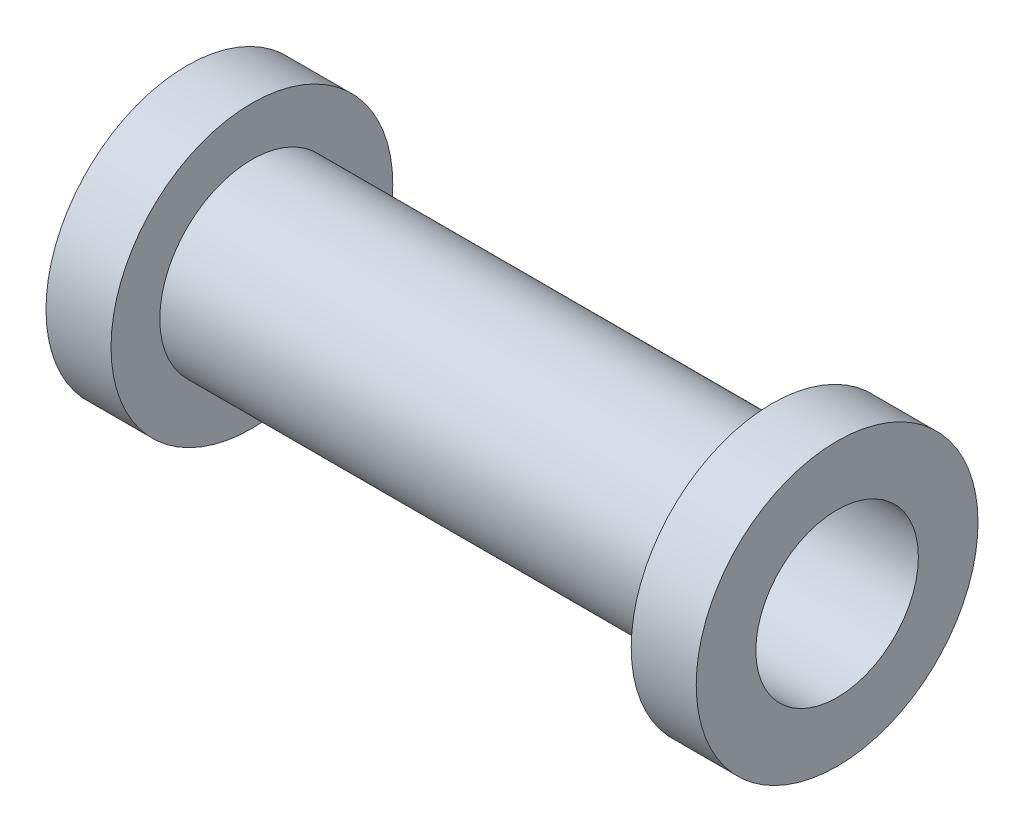
ISO-10303-21;
HEADER;
FILE_DESCRIPTION(('STEP AP214'),'2;1');
FILE_NAME('part.step','',(''),(''),'','','');
FILE_SCHEMA(('AUTOMOTIVE_DESIGN { 1 0 10303 214 1 1 1 1 }'));
ENDSEC;
DATA;
#1=APPLICATION_CONTEXT('core data for automotive mechanical design processes');
#2=APPLICATION_PROTOCOL_DEFINITION('international standard','automotive_design',2000,#1);
#3=PRODUCT_CONTEXT('',#1,'mechanical');
#4=PRODUCT('Part','Part','',(#3));
#5=PRODUCT_RELATED_PRODUCT_CATEGORY('part','',(#4));
#6=PRODUCT_DEFINITION_FORMATION('','',#4);
#7=PRODUCT_DEFINITION_CONTEXT('part definition',#1,'design');
#8=PRODUCT_DEFINITION('design','',#6,#7);
#9=PRODUCT_DEFINITION_SHAPE('','',#8);
#10=(LENGTH_UNIT() NAMED_UNIT(*) SI_UNIT(.MILLI.,.METRE.));
#11=(NAMED_UNIT(*) PLANE_ANGLE_UNIT() SI_UNIT($,.RADIAN.));
#12=(NAMED_UNIT(*) SI_UNIT($,.STERADIAN.) SOLID_ANGLE_UNIT());
#13=UNCERTAINTY_MEASURE_WITH_UNIT(LENGTH_MEASURE(1.E-05),#10,'distance_accuracy_value','');
#14=(GEOMETRIC_REPRESENTATION_CONTEXT(3) GLOBAL_UNCERTAINTY_ASSIGNED_CONTEXT((#13)) GLOBAL_UNIT_ASSIGNED_CONTEXT((#10,
#11,#12)) REPRESENTATION_CONTEXT('',''));
#15=CARTESIAN_POINT('',(0.,0.,0.));
#16=DIRECTION('',(0.,0.,1.));
#17=DIRECTION('',(1.,0.,0.));
#18=AXIS2_PLACEMENT_3D('',#15,#16,#17);
#19=CARTESIAN_POINT('',(-30.48,0.,0.));
#20=DIRECTION('',(-1.,0.,0.));
#21=DIRECTION('',(0.,0.,1.));
#22=AXIS2_PLACEMENT_3D('',#19,#20,#21);
#23=CYLINDRICAL_SURFACE('',#22,10.795);
#24=CARTESIAN_POINT('',(30.48,0.,0.));
#25=DIRECTION('',(-1.,0.,0.));
#26=DIRECTION('',(0.,0.,1.));
#27=AXIS2_PLACEMENT_3D('',#24,#25,#26);
#28=CIRCLE('',#27,10.795);
#29=CARTESIAN_POINT('',(30.48,0.,10.795));
#30=VERTEX_POINT('',#29);
#31=EDGE_CURVE('E64',#30,#30,#28,.T.);
#32=ORIENTED_EDGE('',*,*,#31,.T.);
#33=EDGE_LOOP('',(#32));
#34=FACE_BOUND('',#33,.T.);
#35=CARTESIAN_POINT('',(-30.48,0.,0.));
#36=DIRECTION('',(-1.,0.,0.));
#37=DIRECTION('',(0.,0.,1.));
#38=AXIS2_PLACEMENT_3D('',#35,#36,#37);
#39=CIRCLE('',#38,10.795);
#40=CARTESIAN_POINT('',(-30.48,0.,10.795));
#41=VERTEX_POINT('',#40);
#42=EDGE_CURVE('E10',#41,#41,#39,.T.);
#43=ORIENTED_EDGE('',*,*,#42,.F.);
#44=EDGE_LOOP('',(#43));
#45=FACE_BOUND('',#44,.T.);
#46=ADVANCED_FACE('F36',(#34,#45),#23,.T.);
#47=CARTESIAN_POINT('',(-30.48,0.,0.));
#48=DIRECTION('',(-1.,0.,0.));
#49=DIRECTION('',(0.,0.,1.));
#50=AXIS2_PLACEMENT_3D('',#47,#48,#49);
#51=PLANE('',#50);
#52=CARTESIAN_POINT('',(-30.48,0.,0.));
#53=DIRECTION('',(-1.,0.,0.));
#54=DIRECTION('',(0.,0.,1.));
#55=AXIS2_PLACEMENT_3D('',#52,#53,#54);
#56=CIRCLE('',#55,16.51);
#57=CARTESIAN_POINT('',(-30.48,0.,16.51));
#58=VERTEX_POINT('',#57);
#59=EDGE_CURVE('E42',#58,#58,#56,.T.);
#60=ORIENTED_EDGE('',*,*,#59,.F.);
#61=EDGE_LOOP('',(#60));
#62=FACE_BOUND('',#61,.T.);
#63=ORIENTED_EDGE('',*,*,#42,.T.);
#64=EDGE_LOOP('',(#63));
#65=FACE_BOUND('',#64,.T.);
#66=ADVANCED_FACE('F82',(#62,#65),#51,.F.);
#67=CARTESIAN_POINT('',(-30.48,0.,0.));
#68=DIRECTION('',(-1.,0.,0.));
#69=DIRECTION('',(0.,0.,1.));
#70=AXIS2_PLACEMENT_3D('',#67,#68,#69);
#71=CYLINDRICAL_SURFACE('',#70,16.51);
#72=CARTESIAN_POINT('',(-38.1,0.,0.));
#73=DIRECTION('',(-1.,0.,0.));
#74=DIRECTION('',(0.,0.,1.));
#75=AXIS2_PLACEMENT_3D('',#72,#73,#74);
#76=CIRCLE('',#75,16.51);
#77=CARTESIAN_POINT('',(-38.1,0.,16.51));
#78=VERTEX_POINT('',#77);
#79=EDGE_CURVE('E46',#78,#78,#76,.T.);
#80=ORIENTED_EDGE('',*,*,#79,.F.);
#81=EDGE_LOOP('',(#80));
#82=FACE_BOUND('',#81,.T.);
#83=ORIENTED_EDGE('',*,*,#59,.T.);
#84=EDGE_LOOP('',(#83));
#85=FACE_BOUND('',#84,.T.);
#86=ADVANCED_FACE('F86',(#82,#85),#71,.T.);
#87=CARTESIAN_POINT('',(-38.1,0.,0.));
#88=DIRECTION('',(1.,0.,0.));
#89=DIRECTION('',(0.,0.,-1.));
#90=AXIS2_PLACEMENT_3D('',#87,#88,#89);
#91=PLANE('',#90);
#92=CARTESIAN_POINT('',(-38.1,0.,0.));
#93=DIRECTION('',(-1.,0.,0.));
#94=DIRECTION('',(0.,0.,1.));
#95=AXIS2_PLACEMENT_3D('',#92,#93,#94);
#96=CIRCLE('',#95,9.525);
#97=CARTESIAN_POINT('',(-38.1,0.,9.525));
#98=VERTEX_POINT('',#97);
#99=EDGE_CURVE('E50',#98,#98,#96,.T.);
#100=ORIENTED_EDGE('',*,*,#99,.F.);
#101=EDGE_LOOP('',(#100));
#102=FACE_BOUND('',#101,.T.);
#103=ORIENTED_EDGE('',*,*,#79,.T.);
#104=EDGE_LOOP('',(#103));
#105=FACE_BOUND('',#104,.T.);
#106=ADVANCED_FACE('F91',(#102,#105),#91,.F.);
#107=CARTESIAN_POINT('',(-30.48,0.,0.));
#108=DIRECTION('',(-1.,0.,0.));
#109=DIRECTION('',(0.,0.,1.));
#110=AXIS2_PLACEMENT_3D('',#107,#108,#109);
#111=CYLINDRICAL_SURFACE('',#110,9.525);
#112=ORIENTED_EDGE('',*,*,#99,.T.);
#113=EDGE_LOOP('',(#112));
#114=FACE_BOUND('',#113,.T.);
#115=CARTESIAN_POINT('',(38.1,0.,0.));
#116=DIRECTION('',(-1.,0.,0.));
#117=DIRECTION('',(0.,0.,1.));
#118=AXIS2_PLACEMENT_3D('',#115,#116,#117);
#119=CIRCLE('',#118,9.525);
#120=CARTESIAN_POINT('',(38.1,0.,9.525));
#121=VERTEX_POINT('',#120);
#122=EDGE_CURVE('E55',#121,#121,#119,.T.);
#123=ORIENTED_EDGE('',*,*,#122,.F.);
#124=EDGE_LOOP('',(#123));
#125=FACE_BOUND('',#124,.T.);
#126=ADVANCED_FACE('F97',(#114,#125),#111,.F.);
#127=CARTESIAN_POINT('',(38.1,0.,0.));
#128=DIRECTION('',(1.,0.,0.));
#129=DIRECTION('',(0.,0.,-1.));
#130=AXIS2_PLACEMENT_3D('',#127,#128,#129);
#131=PLANE('',#130);
#132=ORIENTED_EDGE('',*,*,#122,.T.);
#133=EDGE_LOOP('',(#132));
#134=FACE_BOUND('',#133,.T.);
#135=CARTESIAN_POINT('',(38.1,0.,0.));
#136=DIRECTION('',(-1.,0.,0.));
#137=DIRECTION('',(0.,0.,1.));
#138=AXIS2_PLACEMENT_3D('',#135,#136,#137);
#139=CIRCLE('',#138,16.51);
#140=CARTESIAN_POINT('',(38.1,0.,16.51));
#141=VERTEX_POINT('',#140);
#142=EDGE_CURVE('E58',#141,#141,#139,.T.);
#143=ORIENTED_EDGE('',*,*,#142,.F.);
#144=EDGE_LOOP('',(#143));
#145=FACE_BOUND('',#144,.T.);
#146=ADVANCED_FACE('F78',(#134,#145),#131,.T.);
#147=CARTESIAN_POINT('',(-30.48,0.,0.));
#148=DIRECTION('',(-1.,0.,0.));
#149=DIRECTION('',(0.,0.,1.));
#150=AXIS2_PLACEMENT_3D('',#147,#148,#149);
#151=CYLINDRICAL_SURFACE('',#150,16.51);
#152=ORIENTED_EDGE('',*,*,#142,.T.);
#153=EDGE_LOOP('',(#152));
#154=FACE_BOUND('',#153,.T.);
#155=CARTESIAN_POINT('',(30.48,0.,0.));
#156=DIRECTION('',(-1.,0.,0.));
#157=DIRECTION('',(0.,0.,1.));
#158=AXIS2_PLACEMENT_3D('',#155,#156,#157);
#159=CIRCLE('',#158,16.51);
#160=CARTESIAN_POINT('',(30.48,0.,16.51));
#161=VERTEX_POINT('',#160);
#162=EDGE_CURVE('E61',#161,#161,#159,.T.);
#163=ORIENTED_EDGE('',*,*,#162,.F.);
#164=EDGE_LOOP('',(#163));
#165=FACE_BOUND('',#164,.T.);
#166=ADVANCED_FACE('F72',(#154,#165),#151,.T.);
#167=CARTESIAN_POINT('',(30.48,0.,0.));
#168=DIRECTION('',(-1.,0.,0.));
#169=DIRECTION('',(0.,0.,1.));
#170=AXIS2_PLACEMENT_3D('',#167,#168,#169);
#171=PLANE('',#170);
#172=ORIENTED_EDGE('',*,*,#162,.T.);
#173=EDGE_LOOP('',(#172));
#174=FACE_BOUND('',#173,.T.);
#175=ORIENTED_EDGE('',*,*,#31,.F.);
#176=EDGE_LOOP('',(#175));
#177=FACE_BOUND('',#176,.T.);
#178=ADVANCED_FACE('F70',(#174,#177),#171,.T.);
#179=CLOSED_SHELL('',(#46,#66,#86,#106,#126,#146,#166,#178));
#180=MANIFOLD_SOLID_BREP('B2',#179);
#181=ADVANCED_BREP_SHAPE_REPRESENTATION('',(#18,#180),#14);
#182=SHAPE_DEFINITION_REPRESENTATION(#9,#181);
ENDSEC;
END-ISO-10303-21;
